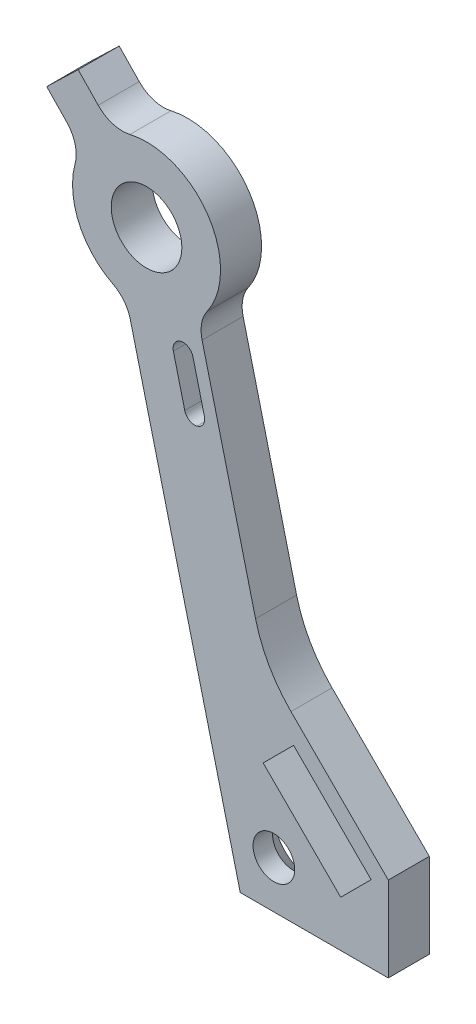
ISO-10303-21;
HEADER;
FILE_DESCRIPTION(('STEP AP214'),'2;1');
FILE_NAME('part.step','',(''),(''),'','','');
FILE_SCHEMA(('AUTOMOTIVE_DESIGN { 1 0 10303 214 1 1 1 1 }'));
ENDSEC;
DATA;
#1=APPLICATION_CONTEXT('core data for automotive mechanical design processes');
#2=APPLICATION_PROTOCOL_DEFINITION('international standard','automotive_design',2000,#1);
#3=PRODUCT_CONTEXT('',#1,'mechanical');
#4=PRODUCT('Part','Part','',(#3));
#5=PRODUCT_RELATED_PRODUCT_CATEGORY('part','',(#4));
#6=PRODUCT_DEFINITION_FORMATION('','',#4);
#7=PRODUCT_DEFINITION_CONTEXT('part definition',#1,'design');
#8=PRODUCT_DEFINITION('design','',#6,#7);
#9=PRODUCT_DEFINITION_SHAPE('','',#8);
#10=(LENGTH_UNIT() NAMED_UNIT(*) SI_UNIT(.MILLI.,.METRE.));
#11=(NAMED_UNIT(*) PLANE_ANGLE_UNIT() SI_UNIT($,.RADIAN.));
#12=(NAMED_UNIT(*) SI_UNIT($,.STERADIAN.) SOLID_ANGLE_UNIT());
#13=UNCERTAINTY_MEASURE_WITH_UNIT(LENGTH_MEASURE(1.E-05),#10,'distance_accuracy_value','');
#14=(GEOMETRIC_REPRESENTATION_CONTEXT(3) GLOBAL_UNCERTAINTY_ASSIGNED_CONTEXT((#13)) GLOBAL_UNIT_ASSIGNED_CONTEXT((#10,
#11,#12)) REPRESENTATION_CONTEXT('',''));
#15=CARTESIAN_POINT('',(0.,0.,0.));
#16=DIRECTION('',(0.,0.,1.));
#17=DIRECTION('',(1.,0.,0.));
#18=AXIS2_PLACEMENT_3D('',#15,#16,#17);
#19=CARTESIAN_POINT('',(4.36654034065617,1.08780763622181,-3.05));
#20=DIRECTION('',(-0.970342297923589,-0.241735030271512,0.));
#21=DIRECTION('',(0.241735030271512,-0.970342297923589,0.));
#22=AXIS2_PLACEMENT_3D('',#19,#20,#21);
#23=PLANE('',#22);
#24=DIRECTION('',(-0.241735030271512,0.970342297923589,0.));
#25=VECTOR('',#24,1.);
#26=CARTESIAN_POINT('',(4.36654034065617,1.08780763622181,0.));
#27=LINE('',#26,#25);
#28=CARTESIAN_POINT('',(-2.66788839228542,29.3245250604018,0.));
#29=VERTEX_POINT('',#28);
#30=CARTESIAN_POINT('',(-3.51396099823572,32.7207231031344,0.));
#31=VERTEX_POINT('',#30);
#32=EDGE_CURVE('E315',#29,#31,#27,.T.);
#33=ORIENTED_EDGE('',*,*,#32,.T.);
#34=DIRECTION('',(0.,0.,1.));
#35=VECTOR('',#34,1.);
#36=CARTESIAN_POINT('',(-3.51396099823572,32.7207231031344,0.));
#37=LINE('',#36,#35);
#38=CARTESIAN_POINT('',(-3.51396099823572,32.7207231031344,-3.05));
#39=VERTEX_POINT('',#38);
#40=EDGE_CURVE('E389',#39,#31,#37,.T.);
#41=ORIENTED_EDGE('',*,*,#40,.F.);
#42=DIRECTION('',(-0.241735030271512,0.970342297923589,0.));
#43=VECTOR('',#42,1.);
#44=CARTESIAN_POINT('',(4.36654034065617,1.08780763622181,-3.05));
#45=LINE('',#44,#43);
#46=CARTESIAN_POINT('',(-2.66788839228542,29.3245250604018,-3.05));
#47=VERTEX_POINT('',#46);
#48=EDGE_CURVE('E271',#47,#39,#45,.T.);
#49=ORIENTED_EDGE('',*,*,#48,.F.);
#50=DIRECTION('',(0.,0.,1.));
#51=VECTOR('',#50,1.);
#52=CARTESIAN_POINT('',(-2.66788839228542,29.3245250604018,-3.05));
#53=LINE('',#52,#51);
#54=EDGE_CURVE('E392',#29,#47,#53,.F.);
#55=ORIENTED_EDGE('',*,*,#54,.F.);
#56=EDGE_LOOP('',(#33,#41,#49,#55));
#57=FACE_BOUND('',#56,.T.);
#58=ADVANCED_FACE('F47',(#57),#23,.T.);
#59=CARTESIAN_POINT('',(7.70970869120796,7.70970869120796,-3.05));
#60=DIRECTION('',(0.707106781186548,0.707106781186547,0.));
#61=DIRECTION('',(-0.707106781186547,0.707106781186548,0.));
#62=AXIS2_PLACEMENT_3D('',#59,#60,#61);
#63=PLANE('',#62);
#64=DIRECTION('',(0.707106781186547,-0.707106781186548,0.));
#65=VECTOR('',#64,1.);
#66=CARTESIAN_POINT('',(7.70970869120796,7.70970869120796,0.));
#67=LINE('',#66,#65);
#68=CARTESIAN_POINT('',(3.96428752719385,11.4551298552221,0.));
#69=VERTEX_POINT('',#68);
#70=CARTESIAN_POINT('',(9.72720779386421,5.6922095885517,0.));
#71=VERTEX_POINT('',#70);
#72=EDGE_CURVE('E305',#69,#71,#67,.T.);
#73=ORIENTED_EDGE('',*,*,#72,.F.);
#74=DIRECTION('',(0.,0.,1.));
#75=VECTOR('',#74,1.);
#76=CARTESIAN_POINT('',(3.96428752719385,11.4551298552221,-3.05));
#77=LINE('',#76,#75);
#78=CARTESIAN_POINT('',(3.96428752719385,11.4551298552221,-3.05));
#79=VERTEX_POINT('',#78);
#80=EDGE_CURVE('E233',#79,#69,#77,.T.);
#81=ORIENTED_EDGE('',*,*,#80,.F.);
#82=DIRECTION('',(0.707106781186547,-0.707106781186548,0.));
#83=VECTOR('',#82,1.);
#84=CARTESIAN_POINT('',(7.70970869120796,7.70970869120796,-3.05));
#85=LINE('',#84,#83);
#86=CARTESIAN_POINT('',(9.72720779386421,5.6922095885517,-3.05));
#87=VERTEX_POINT('',#86);
#88=EDGE_CURVE('E261',#79,#87,#85,.T.);
#89=ORIENTED_EDGE('',*,*,#88,.T.);
#90=DIRECTION('',(0.,0.,1.));
#91=VECTOR('',#90,1.);
#92=CARTESIAN_POINT('',(9.72720779386421,5.6922095885517,-3.05));
#93=LINE('',#92,#91);
#94=EDGE_CURVE('E329',#87,#71,#93,.T.);
#95=ORIENTED_EDGE('',*,*,#94,.T.);
#96=EDGE_LOOP('',(#73,#81,#89,#95));
#97=FACE_BOUND('',#96,.T.);
#98=ADVANCED_FACE('F477',(#97),#63,.F.);
#99=CARTESIAN_POINT('',(2.01749910265625,-2.01749910265625,-3.05));
#100=DIRECTION('',(-0.707106781186547,0.707106781186548,0.));
#101=DIRECTION('',(-0.707106781186548,-0.707106781186547,0.));
#102=AXIS2_PLACEMENT_3D('',#99,#100,#101);
#103=PLANE('',#102);
#104=DIRECTION('',(0.707106781186548,0.707106781186547,0.));
#105=VECTOR('',#104,1.);
#106=CARTESIAN_POINT('',(2.01749910265625,-2.01749910265625,0.));
#107=LINE('',#106,#105);
#108=CARTESIAN_POINT('',(7.46446609406726,3.42946788875475,0.));
#109=VERTEX_POINT('',#108);
#110=EDGE_CURVE('E308',#109,#71,#107,.T.);
#111=ORIENTED_EDGE('',*,*,#110,.T.);
#112=ORIENTED_EDGE('',*,*,#94,.F.);
#113=DIRECTION('',(0.707106781186548,0.707106781186547,0.));
#114=VECTOR('',#113,1.);
#115=CARTESIAN_POINT('',(2.01749910265625,-2.01749910265625,-3.05));
#116=LINE('',#115,#114);
#117=CARTESIAN_POINT('',(7.46446609406726,3.42946788875475,-3.05));
#118=VERTEX_POINT('',#117);
#119=EDGE_CURVE('E264',#118,#87,#116,.T.);
#120=ORIENTED_EDGE('',*,*,#119,.F.);
#121=DIRECTION('',(0.,0.,1.));
#122=VECTOR('',#121,1.);
#123=CARTESIAN_POINT('',(7.46446609406726,3.42946788875475,-3.05));
#124=LINE('',#123,#122);
#125=EDGE_CURVE('E326',#118,#109,#124,.T.);
#126=ORIENTED_EDGE('',*,*,#125,.T.);
#127=EDGE_LOOP('',(#111,#112,#120,#126));
#128=FACE_BOUND('',#127,.T.);
#129=ADVANCED_FACE('F482',(#128),#103,.T.);
#130=CARTESIAN_POINT('',(5.44696699141101,5.44696699141101,-3.05));
#131=DIRECTION('',(-0.707106781186548,-0.707106781186548,0.));
#132=DIRECTION('',(0.707106781186548,-0.707106781186548,0.));
#133=AXIS2_PLACEMENT_3D('',#130,#131,#132);
#134=PLANE('',#133);
#135=DIRECTION('',(-0.707106781186548,0.707106781186548,0.));
#136=VECTOR('',#135,1.);
#137=CARTESIAN_POINT('',(5.44696699141101,5.44696699141101,0.));
#138=LINE('',#137,#136);
#139=CARTESIAN_POINT('',(1.70154582739689,9.19238815542512,0.));
#140=VERTEX_POINT('',#139);
#141=EDGE_CURVE('E310',#109,#140,#138,.T.);
#142=ORIENTED_EDGE('',*,*,#141,.F.);
#143=ORIENTED_EDGE('',*,*,#125,.F.);
#144=DIRECTION('',(-0.707106781186548,0.707106781186548,0.));
#145=VECTOR('',#144,1.);
#146=CARTESIAN_POINT('',(5.44696699141101,5.44696699141101,-3.05));
#147=LINE('',#146,#145);
#148=CARTESIAN_POINT('',(1.70154582739689,9.19238815542512,-3.05));
#149=VERTEX_POINT('',#148);
#150=EDGE_CURVE('E266',#118,#149,#147,.T.);
#151=ORIENTED_EDGE('',*,*,#150,.T.);
#152=DIRECTION('',(0.,0.,1.));
#153=VECTOR('',#152,1.);
#154=CARTESIAN_POINT('',(1.70154582739689,9.19238815542512,-3.05));
#155=LINE('',#154,#153);
#156=EDGE_CURVE('E323',#149,#140,#155,.T.);
#157=ORIENTED_EDGE('',*,*,#156,.T.);
#158=EDGE_LOOP('',(#142,#143,#151,#157));
#159=FACE_BOUND('',#158,.T.);
#160=ADVANCED_FACE('F491',(#159),#134,.F.);
#161=CARTESIAN_POINT('',(-6.96463898907044,39.3326684601052,-3.05));
#162=DIRECTION('',(0.,0.,1.));
#163=DIRECTION('',(-1.,0.,0.));
#164=AXIS2_PLACEMENT_3D('',#161,#162,#163);
#165=CYLINDRICAL_SURFACE('',#164,5.5);
#166=CARTESIAN_POINT('',(-6.96463898907044,39.3326684601052,0.));
#167=DIRECTION('',(0.,0.,1.));
#168=DIRECTION('',(1.,0.,0.));
#169=AXIS2_PLACEMENT_3D('',#166,#167,#168);
#170=CIRCLE('',#169,5.5);
#171=CARTESIAN_POINT('',(-2.45911194166731,36.1782705738013,0.));
#172=VERTEX_POINT('',#171);
#173=CARTESIAN_POINT('',(-8.19716703361366,44.6927873598513,0.));
#174=VERTEX_POINT('',#173);
#175=EDGE_CURVE('E281',#172,#174,#170,.T.);
#176=ORIENTED_EDGE('',*,*,#175,.F.);
#177=DIRECTION('',(0.,0.,1.));
#178=VECTOR('',#177,1.);
#179=CARTESIAN_POINT('',(-2.45911194166731,36.1782705738013,-3.05));
#180=LINE('',#179,#178);
#181=CARTESIAN_POINT('',(-2.45911194166731,36.1782705738013,-3.05));
#182=VERTEX_POINT('',#181);
#183=EDGE_CURVE('E342',#182,#172,#180,.T.);
#184=ORIENTED_EDGE('',*,*,#183,.F.);
#185=CARTESIAN_POINT('',(-6.96463898907044,39.3326684601052,-3.05));
#186=DIRECTION('',(0.,0.,1.));
#187=DIRECTION('',(1.,0.,0.));
#188=AXIS2_PLACEMENT_3D('',#185,#186,#187);
#189=CIRCLE('',#188,5.5);
#190=CARTESIAN_POINT('',(-8.19716703361366,44.6927873598513,-3.05));
#191=VERTEX_POINT('',#190);
#192=EDGE_CURVE('E240',#182,#191,#189,.T.);
#193=ORIENTED_EDGE('',*,*,#192,.T.);
#194=DIRECTION('',(0.,0.,1.));
#195=VECTOR('',#194,1.);
#196=CARTESIAN_POINT('',(-8.19716703361366,44.6927873598513,-3.05));
#197=LINE('',#196,#195);
#198=EDGE_CURVE('E345',#174,#191,#197,.F.);
#199=ORIENTED_EDGE('',*,*,#198,.F.);
#200=EDGE_LOOP('',(#176,#184,#193,#199));
#201=FACE_BOUND('',#200,.T.);
#202=ADVANCED_FACE('F494',(#201),#165,.T.);
#203=CARTESIAN_POINT('',(17.2180416361221,16.6208626165362,-3.05));
#204=DIRECTION('',(0.719473565232645,0.694519826161519,0.));
#205=DIRECTION('',(-0.694519826161519,0.719473565232645,0.));
#206=AXIS2_PLACEMENT_3D('',#203,#204,#205);
#207=PLANE('',#206);
#208=DIRECTION('',(0.694519826161519,-0.719473565232645,0.));
#209=VECTOR('',#208,1.);
#210=CARTESIAN_POINT('',(17.2180416361221,16.6208626165362,-3.05));
#211=LINE('',#210,#209);
#212=CARTESIAN_POINT('',(-12.0461728810211,46.9365252647115,-3.05));
#213=VERTEX_POINT('',#212);
#214=CARTESIAN_POINT('',(-10.5560909669422,45.3929054761502,-3.05));
#215=VERTEX_POINT('',#214);
#216=EDGE_CURVE('E218',#213,#215,#211,.T.);
#217=ORIENTED_EDGE('',*,*,#216,.F.);
#218=DIRECTION('',(0.,0.,1.));
#219=VECTOR('',#218,1.);
#220=CARTESIAN_POINT('',(-12.0461728810211,46.9365252647115,-3.05));
#221=LINE('',#220,#219);
#222=CARTESIAN_POINT('',(-12.0461728810211,46.9365252647115,0.));
#223=VERTEX_POINT('',#222);
#224=EDGE_CURVE('E226',#213,#223,#221,.T.);
#225=ORIENTED_EDGE('',*,*,#224,.T.);
#226=DIRECTION('',(0.694519826161519,-0.719473565232645,0.));
#227=VECTOR('',#226,1.);
#228=CARTESIAN_POINT('',(17.2180416361221,16.6208626165362,0.));
#229=LINE('',#228,#227);
#230=CARTESIAN_POINT('',(-10.5560909669422,45.3929054761502,0.));
#231=VERTEX_POINT('',#230);
#232=EDGE_CURVE('E288',#223,#231,#229,.T.);
#233=ORIENTED_EDGE('',*,*,#232,.T.);
#234=DIRECTION('',(0.,0.,1.));
#235=VECTOR('',#234,1.);
#236=CARTESIAN_POINT('',(-10.5560909669422,45.3929054761502,-3.05));
#237=LINE('',#236,#235);
#238=EDGE_CURVE('E239',#215,#231,#237,.T.);
#239=ORIENTED_EDGE('',*,*,#238,.F.);
#240=EDGE_LOOP('',(#217,#225,#233,#239));
#241=FACE_BOUND('',#240,.T.);
#242=ADVANCED_FACE('F237',(#241),#207,.T.);
#243=CARTESIAN_POINT('',(-29.2642145171432,30.3156626481751,-3.05));
#244=DIRECTION('',(-0.694519826161522,0.719473565232643,0.));
#245=DIRECTION('',(-0.719473565232643,-0.694519826161522,0.));
#246=AXIS2_PLACEMENT_3D('',#243,#244,#245);
#247=PLANE('',#246);
#248=DIRECTION('',(0.719473565232643,0.694519826161522,0.));
#249=VECTOR('',#248,1.);
#250=CARTESIAN_POINT('',(-29.2642145171432,30.3156626481751,0.));
#251=LINE('',#250,#249);
#252=CARTESIAN_POINT('',(-14.3844619680272,44.6793358296865,0.));
#253=VERTEX_POINT('',#252);
#254=EDGE_CURVE('E229',#253,#223,#251,.T.);
#255=ORIENTED_EDGE('',*,*,#254,.T.);
#256=ORIENTED_EDGE('',*,*,#224,.F.);
#257=DIRECTION('',(0.719473565232643,0.694519826161522,0.));
#258=VECTOR('',#257,1.);
#259=CARTESIAN_POINT('',(-29.2642145171432,30.3156626481751,-3.05));
#260=LINE('',#259,#258);
#261=CARTESIAN_POINT('',(-14.3844619680272,44.6793358296865,-3.05));
#262=VERTEX_POINT('',#261);
#263=EDGE_CURVE('E212',#262,#213,#260,.T.);
#264=ORIENTED_EDGE('',*,*,#263,.F.);
#265=DIRECTION('',(0.,0.,1.));
#266=VECTOR('',#265,1.);
#267=CARTESIAN_POINT('',(-14.3844619680272,44.6793358296865,-3.05));
#268=LINE('',#267,#266);
#269=EDGE_CURVE('E234',#262,#253,#268,.T.);
#270=ORIENTED_EDGE('',*,*,#269,.T.);
#271=EDGE_LOOP('',(#255,#256,#264,#270));
#272=FACE_BOUND('',#271,.T.);
#273=ADVANCED_FACE('F227',(#272),#247,.T.);
#274=CARTESIAN_POINT('',(14.8797525491159,14.3636731815112,-3.05));
#275=DIRECTION('',(0.719473565232646,0.694519826161518,0.));
#276=DIRECTION('',(-0.694519826161518,0.719473565232646,0.));
#277=AXIS2_PLACEMENT_3D('',#274,#275,#276);
#278=PLANE('',#277);
#279=DIRECTION('',(0.694519826161518,-0.719473565232647,0.));
#280=VECTOR('',#279,1.);
#281=CARTESIAN_POINT('',(14.8797525491159,14.3636731815112,0.));
#282=LINE('',#281,#280);
#283=CARTESIAN_POINT('',(-12.8943800539482,43.1357160411252,0.));
#284=VERTEX_POINT('',#283);
#285=EDGE_CURVE('E287',#253,#284,#282,.T.);
#286=ORIENTED_EDGE('',*,*,#285,.F.);
#287=ORIENTED_EDGE('',*,*,#269,.F.);
#288=DIRECTION('',(0.694519826161518,-0.719473565232647,0.));
#289=VECTOR('',#288,1.);
#290=CARTESIAN_POINT('',(14.8797525491159,14.3636731815112,-3.05));
#291=LINE('',#290,#289);
#292=CARTESIAN_POINT('',(-12.8943800539482,43.1357160411252,-3.05));
#293=VERTEX_POINT('',#292);
#294=EDGE_CURVE('E220',#262,#293,#291,.T.);
#295=ORIENTED_EDGE('',*,*,#294,.T.);
#296=DIRECTION('',(0.,0.,-1.));
#297=VECTOR('',#296,1.);
#298=CARTESIAN_POINT('',(-12.8943800539482,43.1357160411252,-3.05));
#299=LINE('',#298,#297);
#300=EDGE_CURVE('E354',#284,#293,#299,.T.);
#301=ORIENTED_EDGE('',*,*,#300,.F.);
#302=EDGE_LOOP('',(#286,#287,#295,#301));
#303=FACE_BOUND('',#302,.T.);
#304=ADVANCED_FACE('F520',(#303),#278,.F.);
#305=CARTESIAN_POINT('',(-12.2779311614175,40.7535577208413,-3.05));
#306=VERTEX_POINT('',#305);
#307=CARTESIAN_POINT('',(-9.4637704048032,34.4332458240289,-3.05));
#308=VERTEX_POINT('',#307);
#309=EDGE_CURVE('E245',#306,#308,#189,.T.);
#310=ORIENTED_EDGE('',*,*,#309,.T.);
#311=DIRECTION('',(0.,0.,1.));
#312=VECTOR('',#311,1.);
#313=CARTESIAN_POINT('',(-9.4637704048032,34.4332458240289,-3.05));
#314=LINE('',#313,#312);
#315=CARTESIAN_POINT('',(-9.4637704048032,34.4332458240289,0.));
#316=VERTEX_POINT('',#315);
#317=EDGE_CURVE('E348',#316,#308,#314,.F.);
#318=ORIENTED_EDGE('',*,*,#317,.F.);
#319=CARTESIAN_POINT('',(-12.2779311614175,40.7535577208413,0.));
#320=VERTEX_POINT('',#319);
#321=EDGE_CURVE('E283',#320,#316,#170,.T.);
#322=ORIENTED_EDGE('',*,*,#321,.F.);
#323=DIRECTION('',(0.,0.,1.));
#324=VECTOR('',#323,1.);
#325=CARTESIAN_POINT('',(-12.2779311614175,40.7535577208413,-3.05));
#326=LINE('',#325,#324);
#327=EDGE_CURVE('E351',#306,#320,#326,.T.);
#328=ORIENTED_EDGE('',*,*,#327,.F.);
#329=EDGE_LOOP('',(#310,#318,#322,#328));
#330=FACE_BOUND('',#329,.T.);
#331=ADVANCED_FACE('F516',(#330),#165,.T.);
#332=CARTESIAN_POINT('',(0.,0.,-3.05));
#333=DIRECTION('',(-0.970342297923589,-0.241735030271511,0.));
#334=DIRECTION('',(0.241735030271511,-0.970342297923589,0.));
#335=AXIS2_PLACEMENT_3D('',#332,#333,#334);
#336=PLANE('',#335);
#337=DIRECTION('',(-0.241735030271511,0.970342297923589,0.));
#338=VECTOR('',#337,1.);
#339=CARTESIAN_POINT('',(0.,0.,-3.05));
#340=LINE('',#339,#338);
#341=CARTESIAN_POINT('',(0.,0.,-3.05));
#342=VERTEX_POINT('',#341);
#343=CARTESIAN_POINT('',(-8.17388348532729,32.810573110582,-3.05));
#344=VERTEX_POINT('',#343);
#345=EDGE_CURVE('E249',#342,#344,#340,.T.);
#346=ORIENTED_EDGE('',*,*,#345,.F.);
#347=DIRECTION('',(0.,0.,1.));
#348=VECTOR('',#347,1.);
#349=CARTESIAN_POINT('',(0.,0.,-3.05));
#350=LINE('',#349,#348);
#351=CARTESIAN_POINT('',(0.,0.,0.));
#352=VERTEX_POINT('',#351);
#353=EDGE_CURVE('E337',#342,#352,#350,.T.);
#354=ORIENTED_EDGE('',*,*,#353,.T.);
#355=DIRECTION('',(-0.241735030271511,0.970342297923589,0.));
#356=VECTOR('',#355,1.);
#357=CARTESIAN_POINT('',(0.,0.,0.));
#358=LINE('',#357,#356);
#359=CARTESIAN_POINT('',(-8.17388348532729,32.810573110582,0.));
#360=VERTEX_POINT('',#359);
#361=EDGE_CURVE('E286',#352,#360,#358,.T.);
#362=ORIENTED_EDGE('',*,*,#361,.T.);
#363=DIRECTION('',(0.,0.,1.));
#364=VECTOR('',#363,1.);
#365=CARTESIAN_POINT('',(-8.17388348532729,32.810573110582,-3.05));
#366=LINE('',#365,#364);
#367=EDGE_CURVE('E357',#344,#360,#366,.T.);
#368=ORIENTED_EDGE('',*,*,#367,.F.);
#369=EDGE_LOOP('',(#346,#354,#362,#368));
#370=FACE_BOUND('',#369,.T.);
#371=ADVANCED_FACE('F512',(#370),#336,.T.);
#372=CARTESIAN_POINT('',(0.,0.,-3.05));
#373=DIRECTION('',(0.,1.,0.));
#374=DIRECTION('',(-1.,0.,0.));
#375=AXIS2_PLACEMENT_3D('',#372,#373,#374);
#376=PLANE('',#375);
#377=DIRECTION('',(1.,0.,0.));
#378=VECTOR('',#377,1.);
#379=CARTESIAN_POINT('',(0.,0.,0.));
#380=LINE('',#379,#378);
#381=CARTESIAN_POINT('',(11.,0.,0.));
#382=VERTEX_POINT('',#381);
#383=EDGE_CURVE('E295',#352,#382,#380,.T.);
#384=ORIENTED_EDGE('',*,*,#383,.F.);
#385=ORIENTED_EDGE('',*,*,#353,.F.);
#386=DIRECTION('',(1.,0.,0.));
#387=VECTOR('',#386,1.);
#388=CARTESIAN_POINT('',(0.,0.,-3.05));
#389=LINE('',#388,#387);
#390=CARTESIAN_POINT('',(11.,0.,-3.05));
#391=VERTEX_POINT('',#390);
#392=EDGE_CURVE('E252',#342,#391,#389,.T.);
#393=ORIENTED_EDGE('',*,*,#392,.T.);
#394=DIRECTION('',(0.,0.,1.));
#395=VECTOR('',#394,1.);
#396=CARTESIAN_POINT('',(11.,0.,-3.05));
#397=LINE('',#396,#395);
#398=EDGE_CURVE('E334',#391,#382,#397,.T.);
#399=ORIENTED_EDGE('',*,*,#398,.T.);
#400=EDGE_LOOP('',(#384,#385,#393,#399));
#401=FACE_BOUND('',#400,.T.);
#402=ADVANCED_FACE('F508',(#401),#376,.F.);
#403=CARTESIAN_POINT('',(11.,0.,-3.05));
#404=DIRECTION('',(1.,0.,0.));
#405=DIRECTION('',(0.,0.,1.));
#406=AXIS2_PLACEMENT_3D('',#403,#404,#405);
#407=PLANE('',#406);
#408=DIRECTION('',(0.,-1.,0.));
#409=VECTOR('',#408,1.);
#410=CARTESIAN_POINT('',(11.,0.,0.));
#411=LINE('',#410,#409);
#412=CARTESIAN_POINT('',(11.,6.30390861535611,0.));
#413=VERTEX_POINT('',#412);
#414=EDGE_CURVE('E298',#413,#382,#411,.T.);
#415=ORIENTED_EDGE('',*,*,#414,.T.);
#416=ORIENTED_EDGE('',*,*,#398,.F.);
#417=DIRECTION('',(0.,-1.,0.));
#418=VECTOR('',#417,1.);
#419=CARTESIAN_POINT('',(11.,0.,-3.05));
#420=LINE('',#419,#418);
#421=CARTESIAN_POINT('',(11.,6.30390861535611,-3.05));
#422=VERTEX_POINT('',#421);
#423=EDGE_CURVE('E255',#422,#391,#420,.T.);
#424=ORIENTED_EDGE('',*,*,#423,.F.);
#425=DIRECTION('',(0.,0.,1.));
#426=VECTOR('',#425,1.);
#427=CARTESIAN_POINT('',(11.,6.30390861535611,-3.05));
#428=LINE('',#427,#426);
#429=EDGE_CURVE('E277',#422,#413,#428,.T.);
#430=ORIENTED_EDGE('',*,*,#429,.T.);
#431=EDGE_LOOP('',(#415,#416,#424,#430));
#432=FACE_BOUND('',#431,.T.);
#433=ADVANCED_FACE('F504',(#432),#407,.T.);
#434=CARTESIAN_POINT('',(8.65195430767805,8.65195430767805,-3.05));
#435=DIRECTION('',(0.707106781186547,0.707106781186548,0.));
#436=DIRECTION('',(-0.707106781186548,0.707106781186547,0.));
#437=AXIS2_PLACEMENT_3D('',#434,#435,#436);
#438=PLANE('',#437);
#439=DIRECTION('',(0.707106781186548,-0.707106781186547,0.));
#440=VECTOR('',#439,1.);
#441=CARTESIAN_POINT('',(8.65195430767805,8.65195430767805,0.));
#442=LINE('',#441,#440);
#443=CARTESIAN_POINT('',(3.76932576449459,13.5345828508615,0.));
#444=VERTEX_POINT('',#443);
#445=EDGE_CURVE('E300',#444,#413,#442,.T.);
#446=ORIENTED_EDGE('',*,*,#445,.T.);
#447=ORIENTED_EDGE('',*,*,#429,.F.);
#448=DIRECTION('',(0.707106781186548,-0.707106781186547,0.));
#449=VECTOR('',#448,1.);
#450=CARTESIAN_POINT('',(8.65195430767805,8.65195430767805,-3.05));
#451=LINE('',#450,#449);
#452=CARTESIAN_POINT('',(3.76932576449459,13.5345828508615,-3.05));
#453=VERTEX_POINT('',#452);
#454=EDGE_CURVE('E257',#453,#422,#451,.T.);
#455=ORIENTED_EDGE('',*,*,#454,.F.);
#456=DIRECTION('',(0.,0.,1.));
#457=VECTOR('',#456,1.);
#458=CARTESIAN_POINT('',(3.76932576449459,13.5345828508615,-3.05));
#459=LINE('',#458,#457);
#460=EDGE_CURVE('E382',#444,#453,#459,.F.);
#461=ORIENTED_EDGE('',*,*,#460,.F.);
#462=EDGE_LOOP('',(#446,#447,#455,#461));
#463=FACE_BOUND('',#462,.T.);
#464=ADVANCED_FACE('F489',(#463),#438,.T.);
#465=CARTESIAN_POINT('',(-3.74542116401411,3.74542116401412,-3.05));
#466=DIRECTION('',(-0.707106781186547,0.707106781186548,0.));
#467=DIRECTION('',(-0.707106781186548,-0.707106781186547,0.));
#468=AXIS2_PLACEMENT_3D('',#465,#466,#467);
#469=PLANE('',#468);
#470=DIRECTION('',(0.707106781186548,0.707106781186547,0.));
#471=VECTOR('',#470,1.);
#472=CARTESIAN_POINT('',(-3.74542116401411,3.74542116401412,0.));
#473=LINE('',#472,#471);
#474=EDGE_CURVE('E313',#140,#69,#473,.T.);
#475=ORIENTED_EDGE('',*,*,#474,.F.);
#476=ORIENTED_EDGE('',*,*,#156,.F.);
#477=DIRECTION('',(0.707106781186548,0.707106781186547,0.));
#478=VECTOR('',#477,1.);
#479=CARTESIAN_POINT('',(-3.74542116401411,3.74542116401412,-3.05));
#480=LINE('',#479,#478);
#481=EDGE_CURVE('E269',#149,#79,#480,.T.);
#482=ORIENTED_EDGE('',*,*,#481,.T.);
#483=ORIENTED_EDGE('',*,*,#80,.T.);
#484=EDGE_LOOP('',(#475,#476,#482,#483));
#485=FACE_BOUND('',#484,.T.);
#486=ADVANCED_FACE('F486',(#485),#469,.F.);
#487=CARTESIAN_POINT('',(5.33688263857945,1.32954266649319,-3.05));
#488=DIRECTION('',(0.970342297923591,0.241735030271503,0.));
#489=DIRECTION('',(-0.241735030271503,0.970342297923591,0.));
#490=AXIS2_PLACEMENT_3D('',#487,#488,#489);
#491=PLANE('',#490);
#492=DIRECTION('',(0.241735030271503,-0.970342297923591,0.));
#493=VECTOR('',#492,1.);
#494=CARTESIAN_POINT('',(5.33688263857945,1.32954266649319,-3.05));
#495=LINE('',#494,#493);
#496=CARTESIAN_POINT('',(-2.8370008467476,34.1401157770753,-3.05));
#497=VERTEX_POINT('',#496);
#498=CARTESIAN_POINT('',(1.13697059712415,18.188300360012,-3.05));
#499=VERTEX_POINT('',#498);
#500=EDGE_CURVE('E259',#497,#499,#495,.T.);
#501=ORIENTED_EDGE('',*,*,#500,.F.);
#502=DIRECTION('',(0.,0.,1.));
#503=VECTOR('',#502,1.);
#504=CARTESIAN_POINT('',(-2.83700084674759,34.1401157770753,-3.05));
#505=LINE('',#504,#503);
#506=CARTESIAN_POINT('',(-2.8370008467476,34.1401157770753,0.));
#507=VERTEX_POINT('',#506);
#508=EDGE_CURVE('E360',#507,#497,#505,.F.);
#509=ORIENTED_EDGE('',*,*,#508,.F.);
#510=DIRECTION('',(0.241735030271503,-0.970342297923591,0.));
#511=VECTOR('',#510,1.);
#512=CARTESIAN_POINT('',(5.33688263857945,1.32954266649319,0.));
#513=LINE('',#512,#511);
#514=CARTESIAN_POINT('',(1.13697059712415,18.188300360012,0.));
#515=VERTEX_POINT('',#514);
#516=EDGE_CURVE('E302',#507,#515,#513,.T.);
#517=ORIENTED_EDGE('',*,*,#516,.T.);
#518=DIRECTION('',(0.,0.,1.));
#519=VECTOR('',#518,1.);
#520=CARTESIAN_POINT('',(1.13697059712415,18.188300360012,0.));
#521=LINE('',#520,#519);
#522=EDGE_CURVE('E379',#499,#515,#521,.T.);
#523=ORIENTED_EDGE('',*,*,#522,.F.);
#524=EDGE_LOOP('',(#501,#509,#517,#523));
#525=FACE_BOUND('',#524,.T.);
#526=ADVANCED_FACE('F435',(#525),#491,.T.);
#527=CARTESIAN_POINT('',(-6.96463898907044,39.3326684601052,-3.05));
#528=DIRECTION('',(0.,0.,1.));
#529=DIRECTION('',(-1.,0.,0.));
#530=AXIS2_PLACEMENT_3D('',#527,#528,#529);
#531=CYLINDRICAL_SURFACE('',#530,2.625);
#532=CARTESIAN_POINT('',(-6.96463898907044,39.3326684601052,-3.05));
#533=DIRECTION('',(0.,0.,1.));
#534=DIRECTION('',(1.,0.,0.));
#535=AXIS2_PLACEMENT_3D('',#532,#533,#534);
#536=CIRCLE('',#535,2.625);
#537=CARTESIAN_POINT('',(-4.33963898907044,39.3326684601052,-3.05));
#538=VERTEX_POINT('',#537);
#539=EDGE_CURVE('E243',#538,#538,#536,.T.);
#540=ORIENTED_EDGE('',*,*,#539,.F.);
#541=EDGE_LOOP('',(#540));
#542=FACE_BOUND('',#541,.T.);
#543=CARTESIAN_POINT('',(-6.96463898907044,39.3326684601052,0.));
#544=DIRECTION('',(0.,0.,1.));
#545=DIRECTION('',(1.,0.,0.));
#546=AXIS2_PLACEMENT_3D('',#543,#544,#545);
#547=CIRCLE('',#546,2.625);
#548=CARTESIAN_POINT('',(-4.33963898907044,39.3326684601052,0.));
#549=VERTEX_POINT('',#548);
#550=EDGE_CURVE('E278',#549,#549,#547,.T.);
#551=ORIENTED_EDGE('',*,*,#550,.T.);
#552=EDGE_LOOP('',(#551));
#553=FACE_BOUND('',#552,.T.);
#554=ADVANCED_FACE('F431',(#542,#553),#531,.F.);
#555=CARTESIAN_POINT('',(2.91102689377077,0.725205090814533,-3.05));
#556=DIRECTION('',(0.970342297923589,0.241735030271511,0.));
#557=DIRECTION('',(-0.241735030271511,0.970342297923589,0.));
#558=AXIS2_PLACEMENT_3D('',#555,#556,#557);
#559=PLANE('',#558);
#560=DIRECTION('',(0.241735030271511,-0.970342297923589,0.));
#561=VECTOR('',#560,1.);
#562=CARTESIAN_POINT('',(2.91102689377077,0.725205090814533,-3.05));
#563=LINE('',#562,#561);
#564=CARTESIAN_POINT('',(-4.9694744451211,32.3581205577271,-3.05));
#565=VERTEX_POINT('',#564);
#566=CARTESIAN_POINT('',(-4.12340183917081,28.9619225149945,-3.05));
#567=VERTEX_POINT('',#566);
#568=EDGE_CURVE('E274',#565,#567,#563,.T.);
#569=ORIENTED_EDGE('',*,*,#568,.F.);
#570=DIRECTION('',(0.,0.,1.));
#571=VECTOR('',#570,1.);
#572=CARTESIAN_POINT('',(-4.9694744451211,32.3581205577271,-3.05));
#573=LINE('',#572,#571);
#574=CARTESIAN_POINT('',(-4.9694744451211,32.3581205577271,0.));
#575=VERTEX_POINT('',#574);
#576=EDGE_CURVE('E395',#575,#565,#573,.F.);
#577=ORIENTED_EDGE('',*,*,#576,.F.);
#578=DIRECTION('',(0.241735030271511,-0.970342297923589,0.));
#579=VECTOR('',#578,1.);
#580=CARTESIAN_POINT('',(2.91102689377077,0.725205090814533,0.));
#581=LINE('',#580,#579);
#582=CARTESIAN_POINT('',(-4.12340183917081,28.9619225149945,0.));
#583=VERTEX_POINT('',#582);
#584=EDGE_CURVE('E318',#575,#583,#581,.T.);
#585=ORIENTED_EDGE('',*,*,#584,.T.);
#586=DIRECTION('',(0.,0.,1.));
#587=VECTOR('',#586,1.);
#588=CARTESIAN_POINT('',(-4.12340183917081,28.9619225149945,0.));
#589=LINE('',#588,#587);
#590=EDGE_CURVE('E398',#567,#583,#589,.T.);
#591=ORIENTED_EDGE('',*,*,#590,.F.);
#592=EDGE_LOOP('',(#569,#577,#585,#591));
#593=FACE_BOUND('',#592,.T.);
#594=ADVANCED_FACE('F434',(#593),#559,.T.);
#595=CARTESIAN_POINT('',(0.,0.,-3.05));
#596=DIRECTION('',(0.,0.,-1.));
#597=DIRECTION('',(1.,0.,0.));
#598=AXIS2_PLACEMENT_3D('',#595,#596,#597);
#599=PLANE('',#598);
#600=CARTESIAN_POINT('',(2.5,3.5,-3.05));
#601=DIRECTION('',(0.,0.,1.));
#602=DIRECTION('',(1.,0.,0.));
#603=AXIS2_PLACEMENT_3D('',#600,#601,#602);
#604=CIRCLE('',#603,3.15);
#605=CARTESIAN_POINT('',(5.65,3.5,-3.05));
#606=VERTEX_POINT('',#605);
#607=EDGE_CURVE('E416',#606,#606,#604,.T.);
#608=ORIENTED_EDGE('',*,*,#607,.T.);
#609=EDGE_LOOP('',(#608));
#610=FACE_BOUND('',#609,.T.);
#611=ORIENTED_EDGE('',*,*,#539,.T.);
#612=EDGE_LOOP('',(#611));
#613=FACE_BOUND('',#612,.T.);
#614=ORIENTED_EDGE('',*,*,#500,.T.);
#615=CARTESIAN_POINT('',(10.8403935763601,20.605650662727,-3.05));
#616=DIRECTION('',(0.,0.,1.));
#617=DIRECTION('',(1.,0.,0.));
#618=AXIS2_PLACEMENT_3D('',#615,#616,#617);
#619=CIRCLE('',#618,10.);
#620=EDGE_CURVE('E387',#453,#499,#619,.F.);
#621=ORIENTED_EDGE('',*,*,#620,.F.);
#622=ORIENTED_EDGE('',*,*,#454,.T.);
#623=ORIENTED_EDGE('',*,*,#423,.T.);
#624=ORIENTED_EDGE('',*,*,#392,.F.);
#625=ORIENTED_EDGE('',*,*,#345,.T.);
#626=CARTESIAN_POINT('',(-10.5997392301363,32.2062355349032,-3.05));
#627=DIRECTION('',(0.,0.,1.));
#628=DIRECTION('',(1.,0.,0.));
#629=AXIS2_PLACEMENT_3D('',#626,#627,#628);
#630=CIRCLE('',#629,2.5);
#631=EDGE_CURVE('E373',#308,#344,#630,.F.);
#632=ORIENTED_EDGE('',*,*,#631,.F.);
#633=ORIENTED_EDGE('',*,*,#309,.F.);
#634=CARTESIAN_POINT('',(-14.6930639670298,41.3994164757214,-3.05));
#635=DIRECTION('',(0.,0.,1.));
#636=DIRECTION('',(1.,0.,0.));
#637=AXIS2_PLACEMENT_3D('',#634,#635,#636);
#638=CIRCLE('',#637,2.5);
#639=EDGE_CURVE('E369',#293,#306,#638,.F.);
#640=ORIENTED_EDGE('',*,*,#639,.F.);
#641=ORIENTED_EDGE('',*,*,#294,.F.);
#642=ORIENTED_EDGE('',*,*,#263,.T.);
#643=ORIENTED_EDGE('',*,*,#216,.T.);
#644=CARTESIAN_POINT('',(-8.75740705386057,47.129205041554,-3.05));
#645=DIRECTION('',(0.,0.,1.));
#646=DIRECTION('',(1.,0.,0.));
#647=AXIS2_PLACEMENT_3D('',#644,#645,#646);
#648=CIRCLE('',#647,2.5);
#649=EDGE_CURVE('E365',#191,#215,#648,.F.);
#650=ORIENTED_EDGE('',*,*,#649,.F.);
#651=ORIENTED_EDGE('',*,*,#192,.F.);
#652=CARTESIAN_POINT('',(-0.411145101938617,34.7444533527541,-3.05));
#653=DIRECTION('',(0.,0.,1.));
#654=DIRECTION('',(1.,0.,0.));
#655=AXIS2_PLACEMENT_3D('',#652,#653,#654);
#656=CIRCLE('',#655,2.5);
#657=EDGE_CURVE('E377',#497,#182,#656,.F.);
#658=ORIENTED_EDGE('',*,*,#657,.F.);
#659=EDGE_LOOP('',(#614,#621,#622,#623,#624,#625,#632,#633,#640,#641,#642,#643,#650,#651,#658));
#660=FACE_BOUND('',#659,.T.);
#661=ORIENTED_EDGE('',*,*,#88,.F.);
#662=ORIENTED_EDGE('',*,*,#481,.F.);
#663=ORIENTED_EDGE('',*,*,#150,.F.);
#664=ORIENTED_EDGE('',*,*,#119,.T.);
#665=EDGE_LOOP('',(#661,#662,#663,#664));
#666=FACE_BOUND('',#665,.T.);
#667=ORIENTED_EDGE('',*,*,#568,.T.);
#668=CARTESIAN_POINT('',(-3.39564511572811,29.1432237876982,-3.05));
#669=DIRECTION('',(0.,0.,1.));
#670=DIRECTION('',(1.,0.,0.));
#671=AXIS2_PLACEMENT_3D('',#668,#669,#670);
#672=CIRCLE('',#671,0.75);
#673=CARTESIAN_POINT('',(-3.21434384302448,28.4154670642555,-3.05));
#674=VERTEX_POINT('',#673);
#675=EDGE_CURVE('E409',#674,#567,#672,.F.);
#676=ORIENTED_EDGE('',*,*,#675,.F.);
#677=CARTESIAN_POINT('',(-3.39564511572811,29.1432237876982,-3.05));
#678=DIRECTION('',(0.,0.,1.));
#679=DIRECTION('',(1.,0.,0.));
#680=AXIS2_PLACEMENT_3D('',#677,#678,#679);
#681=CIRCLE('',#680,0.75);
#682=EDGE_CURVE('E403',#47,#674,#681,.F.);
#683=ORIENTED_EDGE('',*,*,#682,.F.);
#684=ORIENTED_EDGE('',*,*,#48,.T.);
#685=CARTESIAN_POINT('',(-4.24171772167841,32.5394218304307,-3.05));
#686=DIRECTION('',(0.,0.,1.));
#687=DIRECTION('',(1.,0.,0.));
#688=AXIS2_PLACEMENT_3D('',#685,#686,#687);
#689=CIRCLE('',#688,0.75);
#690=CARTESIAN_POINT('',(-4.42301899438203,33.2671785538734,-3.05));
#691=VERTEX_POINT('',#690);
#692=EDGE_CURVE('E413',#691,#39,#689,.F.);
#693=ORIENTED_EDGE('',*,*,#692,.F.);
#694=CARTESIAN_POINT('',(-4.24171772167841,32.5394218304307,-3.05));
#695=DIRECTION('',(0.,0.,1.));
#696=DIRECTION('',(1.,0.,0.));
#697=AXIS2_PLACEMENT_3D('',#694,#695,#696);
#698=CIRCLE('',#697,0.75);
#699=EDGE_CURVE('E11',#565,#691,#698,.F.);
#700=ORIENTED_EDGE('',*,*,#699,.F.);
#701=EDGE_LOOP('',(#667,#676,#683,#684,#693,#700));
#702=FACE_BOUND('',#701,.T.);
#703=ADVANCED_FACE('F215',(#610,#613,#660,#666,#702),#599,.T.);
#704=CARTESIAN_POINT('',(0.,0.,0.));
#705=DIRECTION('',(0.,0.,-1.));
#706=DIRECTION('',(1.,0.,0.));
#707=AXIS2_PLACEMENT_3D('',#704,#705,#706);
#708=PLANE('',#707);
#709=CARTESIAN_POINT('',(2.5,3.5,0.));
#710=DIRECTION('',(0.,0.,1.));
#711=DIRECTION('',(1.,0.,0.));
#712=AXIS2_PLACEMENT_3D('',#709,#710,#711);
#713=CIRCLE('',#712,1.55);
#714=CARTESIAN_POINT('',(4.05,3.5,0.));
#715=VERTEX_POINT('',#714);
#716=EDGE_CURVE('E282',#715,#715,#713,.T.);
#717=ORIENTED_EDGE('',*,*,#716,.F.);
#718=EDGE_LOOP('',(#717));
#719=FACE_BOUND('',#718,.T.);
#720=ORIENTED_EDGE('',*,*,#550,.F.);
#721=EDGE_LOOP('',(#720));
#722=FACE_BOUND('',#721,.T.);
#723=ORIENTED_EDGE('',*,*,#175,.T.);
#724=CARTESIAN_POINT('',(-8.75740705386057,47.129205041554,0.));
#725=DIRECTION('',(0.,0.,1.));
#726=DIRECTION('',(1.,0.,0.));
#727=AXIS2_PLACEMENT_3D('',#724,#725,#726);
#728=CIRCLE('',#727,2.5);
#729=EDGE_CURVE('E363',#231,#174,#728,.T.);
#730=ORIENTED_EDGE('',*,*,#729,.F.);
#731=ORIENTED_EDGE('',*,*,#232,.F.);
#732=ORIENTED_EDGE('',*,*,#254,.F.);
#733=ORIENTED_EDGE('',*,*,#285,.T.);
#734=CARTESIAN_POINT('',(-14.6930639670298,41.3994164757214,0.));
#735=DIRECTION('',(0.,0.,1.));
#736=DIRECTION('',(1.,0.,0.));
#737=AXIS2_PLACEMENT_3D('',#734,#735,#736);
#738=CIRCLE('',#737,2.5);
#739=EDGE_CURVE('E367',#320,#284,#738,.T.);
#740=ORIENTED_EDGE('',*,*,#739,.F.);
#741=ORIENTED_EDGE('',*,*,#321,.T.);
#742=CARTESIAN_POINT('',(-10.5997392301363,32.2062355349032,0.));
#743=DIRECTION('',(0.,0.,1.));
#744=DIRECTION('',(1.,0.,0.));
#745=AXIS2_PLACEMENT_3D('',#742,#743,#744);
#746=CIRCLE('',#745,2.5);
#747=EDGE_CURVE('E371',#360,#316,#746,.T.);
#748=ORIENTED_EDGE('',*,*,#747,.F.);
#749=ORIENTED_EDGE('',*,*,#361,.F.);
#750=ORIENTED_EDGE('',*,*,#383,.T.);
#751=ORIENTED_EDGE('',*,*,#414,.F.);
#752=ORIENTED_EDGE('',*,*,#445,.F.);
#753=CARTESIAN_POINT('',(10.8403935763601,20.605650662727,0.));
#754=DIRECTION('',(0.,0.,1.));
#755=DIRECTION('',(1.,0.,0.));
#756=AXIS2_PLACEMENT_3D('',#753,#754,#755);
#757=CIRCLE('',#756,10.);
#758=EDGE_CURVE('E385',#515,#444,#757,.T.);
#759=ORIENTED_EDGE('',*,*,#758,.F.);
#760=ORIENTED_EDGE('',*,*,#516,.F.);
#761=CARTESIAN_POINT('',(-0.411145101938617,34.7444533527541,0.));
#762=DIRECTION('',(0.,0.,1.));
#763=DIRECTION('',(1.,0.,0.));
#764=AXIS2_PLACEMENT_3D('',#761,#762,#763);
#765=CIRCLE('',#764,2.5);
#766=EDGE_CURVE('E375',#172,#507,#765,.T.);
#767=ORIENTED_EDGE('',*,*,#766,.F.);
#768=EDGE_LOOP('',(#723,#730,#731,#732,#733,#740,#741,#748,#749,#750,#751,#752,#759,#760,#767));
#769=FACE_BOUND('',#768,.T.);
#770=ORIENTED_EDGE('',*,*,#72,.T.);
#771=ORIENTED_EDGE('',*,*,#110,.F.);
#772=ORIENTED_EDGE('',*,*,#141,.T.);
#773=ORIENTED_EDGE('',*,*,#474,.T.);
#774=EDGE_LOOP('',(#770,#771,#772,#773));
#775=FACE_BOUND('',#774,.T.);
#776=CARTESIAN_POINT('',(-4.24171772167841,32.5394218304307,0.));
#777=DIRECTION('',(0.,0.,1.));
#778=DIRECTION('',(1.,0.,0.));
#779=AXIS2_PLACEMENT_3D('',#776,#777,#778);
#780=CIRCLE('',#779,0.75);
#781=CARTESIAN_POINT('',(-4.42301899438203,33.2671785538734,0.));
#782=VERTEX_POINT('',#781);
#783=EDGE_CURVE('E411',#31,#782,#780,.T.);
#784=ORIENTED_EDGE('',*,*,#783,.F.);
#785=ORIENTED_EDGE('',*,*,#32,.F.);
#786=CARTESIAN_POINT('',(-3.39564511572811,29.1432237876982,0.));
#787=DIRECTION('',(0.,0.,1.));
#788=DIRECTION('',(1.,0.,0.));
#789=AXIS2_PLACEMENT_3D('',#786,#787,#788);
#790=CIRCLE('',#789,0.75);
#791=CARTESIAN_POINT('',(-3.21434384302448,28.4154670642555,0.));
#792=VERTEX_POINT('',#791);
#793=EDGE_CURVE('E401',#792,#29,#790,.T.);
#794=ORIENTED_EDGE('',*,*,#793,.F.);
#795=CARTESIAN_POINT('',(-3.39564511572811,29.1432237876982,0.));
#796=DIRECTION('',(0.,0.,1.));
#797=DIRECTION('',(1.,0.,0.));
#798=AXIS2_PLACEMENT_3D('',#795,#796,#797);
#799=CIRCLE('',#798,0.75);
#800=EDGE_CURVE('E406',#583,#792,#799,.T.);
#801=ORIENTED_EDGE('',*,*,#800,.F.);
#802=ORIENTED_EDGE('',*,*,#584,.F.);
#803=CARTESIAN_POINT('',(-4.24171772167841,32.5394218304307,0.));
#804=DIRECTION('',(0.,0.,1.));
#805=DIRECTION('',(1.,0.,0.));
#806=AXIS2_PLACEMENT_3D('',#803,#804,#805);
#807=CIRCLE('',#806,0.75);
#808=EDGE_CURVE('E56',#782,#575,#807,.T.);
#809=ORIENTED_EDGE('',*,*,#808,.F.);
#810=EDGE_LOOP('',(#784,#785,#794,#801,#802,#809));
#811=FACE_BOUND('',#810,.T.);
#812=ADVANCED_FACE('F439',(#719,#722,#769,#775,#811),#708,.F.);
#813=CARTESIAN_POINT('',(2.5,3.5,-3.05));
#814=DIRECTION('',(0.,0.,-1.));
#815=DIRECTION('',(1.,0.,0.));
#816=AXIS2_PLACEMENT_3D('',#813,#814,#815);
#817=CYLINDRICAL_SURFACE('',#816,1.55);
#818=ORIENTED_EDGE('',*,*,#716,.T.);
#819=EDGE_LOOP('',(#818));
#820=FACE_BOUND('',#819,.T.);
#821=CARTESIAN_POINT('',(2.5,3.5,-1.45));
#822=DIRECTION('',(0.,0.,1.));
#823=DIRECTION('',(1.,0.,0.));
#824=AXIS2_PLACEMENT_3D('',#821,#822,#823);
#825=CIRCLE('',#824,1.55);
#826=CARTESIAN_POINT('',(4.05,3.5,-1.45));
#827=VERTEX_POINT('',#826);
#828=EDGE_CURVE('E419',#827,#827,#825,.T.);
#829=ORIENTED_EDGE('',*,*,#828,.F.);
#830=EDGE_LOOP('',(#829));
#831=FACE_BOUND('',#830,.T.);
#832=ADVANCED_FACE('F442',(#820,#831),#817,.F.);
#833=CARTESIAN_POINT('',(2.5,3.5,-3.05));
#834=DIRECTION('',(0.,0.,-1.));
#835=DIRECTION('',(1.,0.,0.));
#836=AXIS2_PLACEMENT_3D('',#833,#834,#835);
#837=CONICAL_SURFACE('',#836,3.15,0.785398163397448);
#838=ORIENTED_EDGE('',*,*,#828,.T.);
#839=EDGE_LOOP('',(#838));
#840=FACE_BOUND('',#839,.T.);
#841=ORIENTED_EDGE('',*,*,#607,.F.);
#842=EDGE_LOOP('',(#841));
#843=FACE_BOUND('',#842,.T.);
#844=ADVANCED_FACE('F533',(#840,#843),#837,.F.);
#845=CARTESIAN_POINT('',(-8.75740705386057,47.129205041554,-3.05));
#846=DIRECTION('',(0.,0.,1.));
#847=DIRECTION('',(-1.,0.,0.));
#848=AXIS2_PLACEMENT_3D('',#845,#846,#847);
#849=CYLINDRICAL_SURFACE('',#848,2.5);
#850=ORIENTED_EDGE('',*,*,#649,.T.);
#851=ORIENTED_EDGE('',*,*,#238,.T.);
#852=ORIENTED_EDGE('',*,*,#729,.T.);
#853=ORIENTED_EDGE('',*,*,#198,.T.);
#854=EDGE_LOOP('',(#850,#851,#852,#853));
#855=FACE_BOUND('',#854,.T.);
#856=ADVANCED_FACE('F529',(#855),#849,.F.);
#857=CARTESIAN_POINT('',(-14.6930639670298,41.3994164757214,-3.05));
#858=DIRECTION('',(0.,0.,1.));
#859=DIRECTION('',(-1.,0.,0.));
#860=AXIS2_PLACEMENT_3D('',#857,#858,#859);
#861=CYLINDRICAL_SURFACE('',#860,2.5);
#862=ORIENTED_EDGE('',*,*,#639,.T.);
#863=ORIENTED_EDGE('',*,*,#327,.T.);
#864=ORIENTED_EDGE('',*,*,#739,.T.);
#865=ORIENTED_EDGE('',*,*,#300,.T.);
#866=EDGE_LOOP('',(#862,#863,#864,#865));
#867=FACE_BOUND('',#866,.T.);
#868=ADVANCED_FACE('F532',(#867),#861,.F.);
#869=CARTESIAN_POINT('',(-10.5997392301363,32.2062355349032,-3.05));
#870=DIRECTION('',(0.,0.,1.));
#871=DIRECTION('',(-1.,0.,0.));
#872=AXIS2_PLACEMENT_3D('',#869,#870,#871);
#873=CYLINDRICAL_SURFACE('',#872,2.5);
#874=ORIENTED_EDGE('',*,*,#631,.T.);
#875=ORIENTED_EDGE('',*,*,#367,.T.);
#876=ORIENTED_EDGE('',*,*,#747,.T.);
#877=ORIENTED_EDGE('',*,*,#317,.T.);
#878=EDGE_LOOP('',(#874,#875,#876,#877));
#879=FACE_BOUND('',#878,.T.);
#880=ADVANCED_FACE('F537',(#879),#873,.F.);
#881=CARTESIAN_POINT('',(-0.411145101938617,34.7444533527541,-3.05));
#882=DIRECTION('',(0.,0.,1.));
#883=DIRECTION('',(-1.,0.,0.));
#884=AXIS2_PLACEMENT_3D('',#881,#882,#883);
#885=CYLINDRICAL_SURFACE('',#884,2.5);
#886=ORIENTED_EDGE('',*,*,#657,.T.);
#887=ORIENTED_EDGE('',*,*,#183,.T.);
#888=ORIENTED_EDGE('',*,*,#766,.T.);
#889=ORIENTED_EDGE('',*,*,#508,.T.);
#890=EDGE_LOOP('',(#886,#887,#888,#889));
#891=FACE_BOUND('',#890,.T.);
#892=ADVANCED_FACE('F541',(#891),#885,.F.);
#893=CARTESIAN_POINT('',(10.8403935763601,20.605650662727,-3.05));
#894=DIRECTION('',(0.,0.,-1.));
#895=DIRECTION('',(1.,0.,0.));
#896=AXIS2_PLACEMENT_3D('',#893,#894,#895);
#897=CYLINDRICAL_SURFACE('',#896,10.);
#898=ORIENTED_EDGE('',*,*,#620,.T.);
#899=ORIENTED_EDGE('',*,*,#522,.T.);
#900=ORIENTED_EDGE('',*,*,#758,.T.);
#901=ORIENTED_EDGE('',*,*,#460,.T.);
#902=EDGE_LOOP('',(#898,#899,#900,#901));
#903=FACE_BOUND('',#902,.T.);
#904=ADVANCED_FACE('F545',(#903),#897,.F.);
#905=CARTESIAN_POINT('',(-3.39564511572811,29.1432237876982,-3.05));
#906=DIRECTION('',(0.,0.,-1.));
#907=DIRECTION('',(1.,0.,0.));
#908=AXIS2_PLACEMENT_3D('',#905,#906,#907);
#909=CYLINDRICAL_SURFACE('',#908,0.75);
#910=ORIENTED_EDGE('',*,*,#590,.T.);
#911=ORIENTED_EDGE('',*,*,#800,.T.);
#912=DIRECTION('',(0.,0.,1.));
#913=VECTOR('',#912,1.);
#914=CARTESIAN_POINT('',(-3.21434384302449,28.4154670642555,-3.05));
#915=LINE('',#914,#913);
#916=EDGE_CURVE('E415',#792,#674,#915,.F.);
#917=ORIENTED_EDGE('',*,*,#916,.T.);
#918=ORIENTED_EDGE('',*,*,#675,.T.);
#919=EDGE_LOOP('',(#910,#911,#917,#918));
#920=FACE_BOUND('',#919,.T.);
#921=ADVANCED_FACE('F465',(#920),#909,.F.);
#922=CARTESIAN_POINT('',(-3.39564511572811,29.1432237876982,-3.05));
#923=DIRECTION('',(0.,0.,-1.));
#924=DIRECTION('',(1.,0.,0.));
#925=AXIS2_PLACEMENT_3D('',#922,#923,#924);
#926=CYLINDRICAL_SURFACE('',#925,0.75);
#927=ORIENTED_EDGE('',*,*,#682,.T.);
#928=ORIENTED_EDGE('',*,*,#916,.F.);
#929=ORIENTED_EDGE('',*,*,#793,.T.);
#930=ORIENTED_EDGE('',*,*,#54,.T.);
#931=EDGE_LOOP('',(#927,#928,#929,#930));
#932=FACE_BOUND('',#931,.T.);
#933=ADVANCED_FACE('F461',(#932),#926,.F.);
#934=CARTESIAN_POINT('',(-4.24171772167841,32.5394218304307,-3.05));
#935=DIRECTION('',(0.,0.,-1.));
#936=DIRECTION('',(1.,0.,0.));
#937=AXIS2_PLACEMENT_3D('',#934,#935,#936);
#938=CYLINDRICAL_SURFACE('',#937,0.75);
#939=DIRECTION('',(0.,0.,1.));
#940=VECTOR('',#939,1.);
#941=CARTESIAN_POINT('',(-4.42301899438203,33.2671785538734,0.));
#942=LINE('',#941,#940);
#943=EDGE_CURVE('E51',#691,#782,#942,.T.);
#944=ORIENTED_EDGE('',*,*,#943,.T.);
#945=ORIENTED_EDGE('',*,*,#808,.T.);
#946=ORIENTED_EDGE('',*,*,#576,.T.);
#947=ORIENTED_EDGE('',*,*,#699,.T.);
#948=EDGE_LOOP('',(#944,#945,#946,#947));
#949=FACE_BOUND('',#948,.T.);
#950=ADVANCED_FACE('F49',(#949),#938,.F.);
#951=CARTESIAN_POINT('',(-4.24171772167841,32.5394218304307,-3.05));
#952=DIRECTION('',(0.,0.,-1.));
#953=DIRECTION('',(1.,0.,0.));
#954=AXIS2_PLACEMENT_3D('',#951,#952,#953);
#955=CYLINDRICAL_SURFACE('',#954,0.75);
#956=ORIENTED_EDGE('',*,*,#692,.T.);
#957=ORIENTED_EDGE('',*,*,#40,.T.);
#958=ORIENTED_EDGE('',*,*,#783,.T.);
#959=ORIENTED_EDGE('',*,*,#943,.F.);
#960=EDGE_LOOP('',(#956,#957,#958,#959));
#961=FACE_BOUND('',#960,.T.);
#962=ADVANCED_FACE('F455',(#961),#955,.F.);
#963=CLOSED_SHELL('',(#58,#98,#129,#160,#202,#242,#273,#304,#331,#371,#402,#433,#464,#486,#526,
#554,#594,#703,#812,#832,#844,#856,#868,#880,#892,#904,#921,#933,#950,#962));
#964=MANIFOLD_SOLID_BREP('B2',#963);
#965=ADVANCED_BREP_SHAPE_REPRESENTATION('',(#18,#964),#14);
#966=SHAPE_DEFINITION_REPRESENTATION(#9,#965);
ENDSEC;
END-ISO-10303-21;
